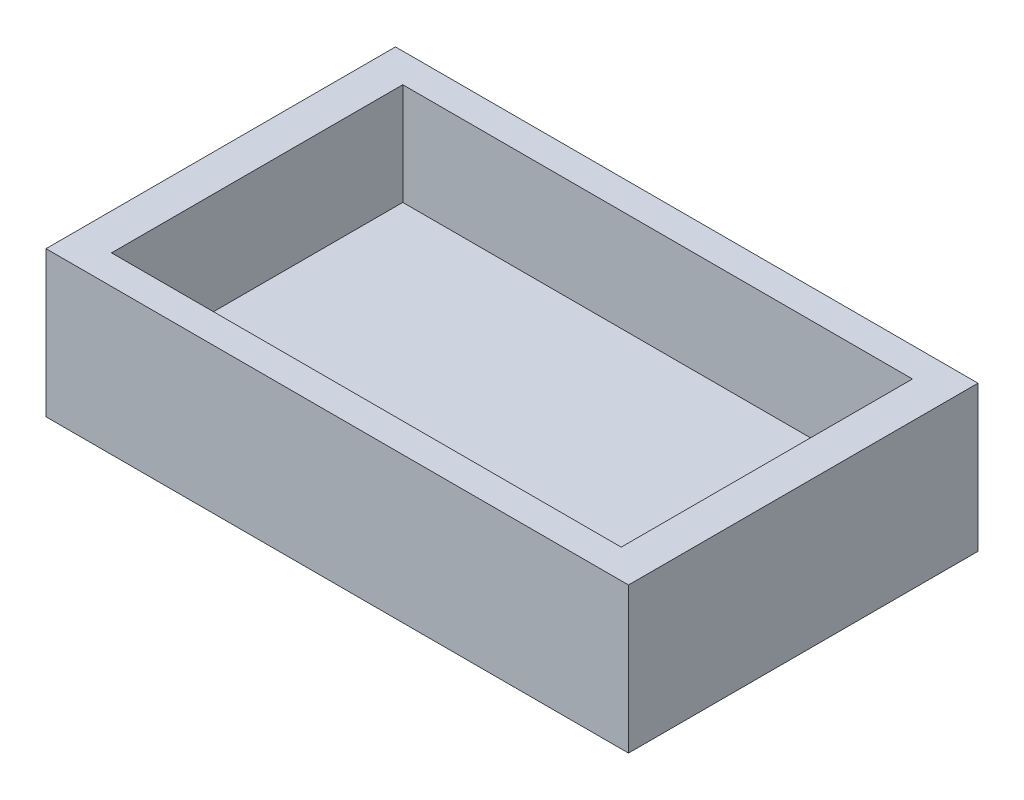
ISO-10303-21;
HEADER;
FILE_DESCRIPTION(('STEP AP214'),'2;1');
FILE_NAME('part.step','',(''),(''),'','','');
FILE_SCHEMA(('AUTOMOTIVE_DESIGN { 1 0 10303 214 1 1 1 1 }'));
ENDSEC;
DATA;
#1=APPLICATION_CONTEXT('core data for automotive mechanical design processes');
#2=APPLICATION_PROTOCOL_DEFINITION('international standard','automotive_design',2000,#1);
#3=PRODUCT_CONTEXT('',#1,'mechanical');
#4=PRODUCT('Part','Part','',(#3));
#5=PRODUCT_RELATED_PRODUCT_CATEGORY('part','',(#4));
#6=PRODUCT_DEFINITION_FORMATION('','',#4);
#7=PRODUCT_DEFINITION_CONTEXT('part definition',#1,'design');
#8=PRODUCT_DEFINITION('design','',#6,#7);
#9=PRODUCT_DEFINITION_SHAPE('','',#8);
#10=(LENGTH_UNIT() NAMED_UNIT(*) SI_UNIT(.MILLI.,.METRE.));
#11=(NAMED_UNIT(*) PLANE_ANGLE_UNIT() SI_UNIT($,.RADIAN.));
#12=(NAMED_UNIT(*) SI_UNIT($,.STERADIAN.) SOLID_ANGLE_UNIT());
#13=UNCERTAINTY_MEASURE_WITH_UNIT(LENGTH_MEASURE(1.E-05),#10,'distance_accuracy_value','');
#14=(GEOMETRIC_REPRESENTATION_CONTEXT(3) GLOBAL_UNCERTAINTY_ASSIGNED_CONTEXT((#13)) GLOBAL_UNIT_ASSIGNED_CONTEXT((#10,
#11,#12)) REPRESENTATION_CONTEXT('',''));
#15=CARTESIAN_POINT('',(0.,0.,0.));
#16=DIRECTION('',(0.,0.,1.));
#17=DIRECTION('',(1.,0.,0.));
#18=AXIS2_PLACEMENT_3D('',#15,#16,#17);
#19=CARTESIAN_POINT('',(20.,10.,-12.));
#20=DIRECTION('',(-1.,0.,0.));
#21=DIRECTION('',(0.,0.,1.));
#22=AXIS2_PLACEMENT_3D('',#19,#20,#21);
#23=PLANE('',#22);
#24=DIRECTION('',(0.,0.,1.));
#25=VECTOR('',#24,1.);
#26=CARTESIAN_POINT('',(20.,0.,-12.));
#27=LINE('',#26,#25);
#28=CARTESIAN_POINT('',(20.,0.,12.));
#29=VERTEX_POINT('',#28);
#30=CARTESIAN_POINT('',(20.,0.,-12.));
#31=VERTEX_POINT('',#30);
#32=EDGE_CURVE('E143',#29,#31,#27,.F.);
#33=ORIENTED_EDGE('',*,*,#32,.T.);
#34=DIRECTION('',(0.,-1.,0.));
#35=VECTOR('',#34,1.);
#36=CARTESIAN_POINT('',(20.,10.,-12.));
#37=LINE('',#36,#35);
#38=CARTESIAN_POINT('',(20.,10.,-12.));
#39=VERTEX_POINT('',#38);
#40=EDGE_CURVE('E12',#39,#31,#37,.T.);
#41=ORIENTED_EDGE('',*,*,#40,.F.);
#42=DIRECTION('',(0.,0.,-1.));
#43=VECTOR('',#42,1.);
#44=CARTESIAN_POINT('',(20.,10.,-12.));
#45=LINE('',#44,#43);
#46=CARTESIAN_POINT('',(20.,10.,12.));
#47=VERTEX_POINT('',#46);
#48=EDGE_CURVE('E142',#47,#39,#45,.T.);
#49=ORIENTED_EDGE('',*,*,#48,.F.);
#50=DIRECTION('',(0.,-1.,0.));
#51=VECTOR('',#50,1.);
#52=CARTESIAN_POINT('',(20.,10.,12.));
#53=LINE('',#52,#51);
#54=EDGE_CURVE('E130',#47,#29,#53,.T.);
#55=ORIENTED_EDGE('',*,*,#54,.T.);
#56=EDGE_LOOP('',(#33,#41,#49,#55));
#57=FACE_BOUND('',#56,.T.);
#58=ADVANCED_FACE('F38',(#57),#23,.F.);
#59=CARTESIAN_POINT('',(-20.,10.,-12.));
#60=DIRECTION('',(0.,0.,1.));
#61=DIRECTION('',(1.,0.,0.));
#62=AXIS2_PLACEMENT_3D('',#59,#60,#61);
#63=PLANE('',#62);
#64=DIRECTION('',(1.,0.,0.));
#65=VECTOR('',#64,1.);
#66=CARTESIAN_POINT('',(-20.,0.,-12.));
#67=LINE('',#66,#65);
#68=CARTESIAN_POINT('',(-20.,0.,-12.));
#69=VERTEX_POINT('',#68);
#70=EDGE_CURVE('E41',#31,#69,#67,.F.);
#71=ORIENTED_EDGE('',*,*,#70,.T.);
#72=DIRECTION('',(0.,-1.,0.));
#73=VECTOR('',#72,1.);
#74=CARTESIAN_POINT('',(-20.,10.,-12.));
#75=LINE('',#74,#73);
#76=CARTESIAN_POINT('',(-20.,10.,-12.));
#77=VERTEX_POINT('',#76);
#78=EDGE_CURVE('E47',#77,#69,#75,.T.);
#79=ORIENTED_EDGE('',*,*,#78,.F.);
#80=DIRECTION('',(-1.,0.,0.));
#81=VECTOR('',#80,1.);
#82=CARTESIAN_POINT('',(-20.,10.,-12.));
#83=LINE('',#82,#81);
#84=EDGE_CURVE('E118',#39,#77,#83,.T.);
#85=ORIENTED_EDGE('',*,*,#84,.F.);
#86=ORIENTED_EDGE('',*,*,#40,.T.);
#87=EDGE_LOOP('',(#71,#79,#85,#86));
#88=FACE_BOUND('',#87,.T.);
#89=ADVANCED_FACE('F164',(#88),#63,.F.);
#90=CARTESIAN_POINT('',(-20.,10.,-12.));
#91=DIRECTION('',(1.,0.,0.));
#92=DIRECTION('',(0.,0.,-1.));
#93=AXIS2_PLACEMENT_3D('',#90,#91,#92);
#94=PLANE('',#93);
#95=DIRECTION('',(0.,0.,-1.));
#96=VECTOR('',#95,1.);
#97=CARTESIAN_POINT('',(-20.,0.,-12.));
#98=LINE('',#97,#96);
#99=CARTESIAN_POINT('',(-20.,0.,12.));
#100=VERTEX_POINT('',#99);
#101=EDGE_CURVE('E127',#69,#100,#98,.F.);
#102=ORIENTED_EDGE('',*,*,#101,.T.);
#103=DIRECTION('',(0.,-1.,0.));
#104=VECTOR('',#103,1.);
#105=CARTESIAN_POINT('',(-20.,10.,12.));
#106=LINE('',#105,#104);
#107=CARTESIAN_POINT('',(-20.,10.,12.));
#108=VERTEX_POINT('',#107);
#109=EDGE_CURVE('E125',#108,#100,#106,.T.);
#110=ORIENTED_EDGE('',*,*,#109,.F.);
#111=DIRECTION('',(0.,0.,1.));
#112=VECTOR('',#111,1.);
#113=CARTESIAN_POINT('',(-20.,10.,-12.));
#114=LINE('',#113,#112);
#115=EDGE_CURVE('E111',#77,#108,#114,.T.);
#116=ORIENTED_EDGE('',*,*,#115,.F.);
#117=ORIENTED_EDGE('',*,*,#78,.T.);
#118=EDGE_LOOP('',(#102,#110,#116,#117));
#119=FACE_BOUND('',#118,.T.);
#120=ADVANCED_FACE('F126',(#119),#94,.F.);
#121=CARTESIAN_POINT('',(-20.,10.,12.));
#122=DIRECTION('',(0.,0.,-1.));
#123=DIRECTION('',(-1.,0.,0.));
#124=AXIS2_PLACEMENT_3D('',#121,#122,#123);
#125=PLANE('',#124);
#126=DIRECTION('',(-1.,0.,0.));
#127=VECTOR('',#126,1.);
#128=CARTESIAN_POINT('',(-20.,0.,12.));
#129=LINE('',#128,#127);
#130=EDGE_CURVE('E141',#100,#29,#129,.F.);
#131=ORIENTED_EDGE('',*,*,#130,.T.);
#132=ORIENTED_EDGE('',*,*,#54,.F.);
#133=DIRECTION('',(1.,0.,0.));
#134=VECTOR('',#133,1.);
#135=CARTESIAN_POINT('',(-20.,10.,12.));
#136=LINE('',#135,#134);
#137=EDGE_CURVE('E116',#108,#47,#136,.T.);
#138=ORIENTED_EDGE('',*,*,#137,.F.);
#139=ORIENTED_EDGE('',*,*,#109,.T.);
#140=EDGE_LOOP('',(#131,#132,#138,#139));
#141=FACE_BOUND('',#140,.T.);
#142=ADVANCED_FACE('F132',(#141),#125,.F.);
#143=CARTESIAN_POINT('',(0.,10.,0.));
#144=DIRECTION('',(0.,1.,0.));
#145=DIRECTION('',(0.,0.,1.));
#146=AXIS2_PLACEMENT_3D('',#143,#144,#145);
#147=PLANE('',#146);
#148=DIRECTION('',(0.,0.,-1.));
#149=VECTOR('',#148,1.);
#150=CARTESIAN_POINT('',(17.5,10.,-10.));
#151=LINE('',#150,#149);
#152=CARTESIAN_POINT('',(17.5,10.,10.));
#153=VERTEX_POINT('',#152);
#154=CARTESIAN_POINT('',(17.5,10.,-10.));
#155=VERTEX_POINT('',#154);
#156=EDGE_CURVE('E56',#153,#155,#151,.T.);
#157=ORIENTED_EDGE('',*,*,#156,.F.);
#158=DIRECTION('',(1.,0.,0.));
#159=VECTOR('',#158,1.);
#160=CARTESIAN_POINT('',(-17.5,10.,10.));
#161=LINE('',#160,#159);
#162=CARTESIAN_POINT('',(-17.5,10.,10.));
#163=VERTEX_POINT('',#162);
#164=EDGE_CURVE('E156',#163,#153,#161,.T.);
#165=ORIENTED_EDGE('',*,*,#164,.F.);
#166=DIRECTION('',(0.,0.,1.));
#167=VECTOR('',#166,1.);
#168=CARTESIAN_POINT('',(-17.5,10.,-10.));
#169=LINE('',#168,#167);
#170=CARTESIAN_POINT('',(-17.5,10.,-10.));
#171=VERTEX_POINT('',#170);
#172=EDGE_CURVE('E192',#171,#163,#169,.T.);
#173=ORIENTED_EDGE('',*,*,#172,.F.);
#174=DIRECTION('',(-1.,0.,0.));
#175=VECTOR('',#174,1.);
#176=CARTESIAN_POINT('',(-17.5,10.,-10.));
#177=LINE('',#176,#175);
#178=EDGE_CURVE('E175',#155,#171,#177,.T.);
#179=ORIENTED_EDGE('',*,*,#178,.F.);
#180=EDGE_LOOP('',(#157,#165,#173,#179));
#181=FACE_BOUND('',#180,.T.);
#182=ORIENTED_EDGE('',*,*,#48,.T.);
#183=ORIENTED_EDGE('',*,*,#84,.T.);
#184=ORIENTED_EDGE('',*,*,#115,.T.);
#185=ORIENTED_EDGE('',*,*,#137,.T.);
#186=EDGE_LOOP('',(#182,#183,#184,#185));
#187=FACE_BOUND('',#186,.T.);
#188=ADVANCED_FACE('F114',(#181,#187),#147,.T.);
#189=CARTESIAN_POINT('',(17.5,3.,-10.));
#190=DIRECTION('',(1.,0.,0.));
#191=DIRECTION('',(0.,0.,-1.));
#192=AXIS2_PLACEMENT_3D('',#189,#190,#191);
#193=PLANE('',#192);
#194=ORIENTED_EDGE('',*,*,#156,.T.);
#195=DIRECTION('',(0.,1.,0.));
#196=VECTOR('',#195,1.);
#197=CARTESIAN_POINT('',(17.5,3.,-10.));
#198=LINE('',#197,#196);
#199=CARTESIAN_POINT('',(17.5,3.,-10.));
#200=VERTEX_POINT('',#199);
#201=EDGE_CURVE('E160',#200,#155,#198,.T.);
#202=ORIENTED_EDGE('',*,*,#201,.F.);
#203=DIRECTION('',(0.,0.,-1.));
#204=VECTOR('',#203,1.);
#205=CARTESIAN_POINT('',(17.5,3.,-10.));
#206=LINE('',#205,#204);
#207=CARTESIAN_POINT('',(17.5,3.,10.));
#208=VERTEX_POINT('',#207);
#209=EDGE_CURVE('E180',#208,#200,#206,.T.);
#210=ORIENTED_EDGE('',*,*,#209,.F.);
#211=DIRECTION('',(0.,1.,0.));
#212=VECTOR('',#211,1.);
#213=CARTESIAN_POINT('',(17.5,3.,10.));
#214=LINE('',#213,#212);
#215=EDGE_CURVE('E145',#208,#153,#214,.T.);
#216=ORIENTED_EDGE('',*,*,#215,.T.);
#217=EDGE_LOOP('',(#194,#202,#210,#216));
#218=FACE_BOUND('',#217,.T.);
#219=ADVANCED_FACE('F206',(#218),#193,.F.);
#220=CARTESIAN_POINT('',(-17.5,3.,10.));
#221=DIRECTION('',(0.,0.,1.));
#222=DIRECTION('',(1.,0.,0.));
#223=AXIS2_PLACEMENT_3D('',#220,#221,#222);
#224=PLANE('',#223);
#225=ORIENTED_EDGE('',*,*,#164,.T.);
#226=ORIENTED_EDGE('',*,*,#215,.F.);
#227=DIRECTION('',(1.,0.,0.));
#228=VECTOR('',#227,1.);
#229=CARTESIAN_POINT('',(-17.5,3.,10.));
#230=LINE('',#229,#228);
#231=CARTESIAN_POINT('',(-17.5,3.,10.));
#232=VERTEX_POINT('',#231);
#233=EDGE_CURVE('E162',#232,#208,#230,.T.);
#234=ORIENTED_EDGE('',*,*,#233,.F.);
#235=DIRECTION('',(0.,1.,0.));
#236=VECTOR('',#235,1.);
#237=CARTESIAN_POINT('',(-17.5,3.,10.));
#238=LINE('',#237,#236);
#239=EDGE_CURVE('E149',#232,#163,#238,.T.);
#240=ORIENTED_EDGE('',*,*,#239,.T.);
#241=EDGE_LOOP('',(#225,#226,#234,#240));
#242=FACE_BOUND('',#241,.T.);
#243=ADVANCED_FACE('F198',(#242),#224,.F.);
#244=CARTESIAN_POINT('',(-17.5,3.,-10.));
#245=DIRECTION('',(-1.,0.,0.));
#246=DIRECTION('',(0.,0.,1.));
#247=AXIS2_PLACEMENT_3D('',#244,#245,#246);
#248=PLANE('',#247);
#249=ORIENTED_EDGE('',*,*,#172,.T.);
#250=ORIENTED_EDGE('',*,*,#239,.F.);
#251=DIRECTION('',(0.,0.,1.));
#252=VECTOR('',#251,1.);
#253=CARTESIAN_POINT('',(-17.5,3.,-10.));
#254=LINE('',#253,#252);
#255=CARTESIAN_POINT('',(-17.5,3.,-10.));
#256=VERTEX_POINT('',#255);
#257=EDGE_CURVE('E186',#256,#232,#254,.T.);
#258=ORIENTED_EDGE('',*,*,#257,.F.);
#259=DIRECTION('',(0.,1.,0.));
#260=VECTOR('',#259,1.);
#261=CARTESIAN_POINT('',(-17.5,3.,-10.));
#262=LINE('',#261,#260);
#263=EDGE_CURVE('E153',#256,#171,#262,.T.);
#264=ORIENTED_EDGE('',*,*,#263,.T.);
#265=EDGE_LOOP('',(#249,#250,#258,#264));
#266=FACE_BOUND('',#265,.T.);
#267=ADVANCED_FACE('F209',(#266),#248,.F.);
#268=CARTESIAN_POINT('',(-17.5,3.,-10.));
#269=DIRECTION('',(0.,0.,-1.));
#270=DIRECTION('',(-1.,0.,0.));
#271=AXIS2_PLACEMENT_3D('',#268,#269,#270);
#272=PLANE('',#271);
#273=ORIENTED_EDGE('',*,*,#178,.T.);
#274=ORIENTED_EDGE('',*,*,#263,.F.);
#275=DIRECTION('',(-1.,0.,0.));
#276=VECTOR('',#275,1.);
#277=CARTESIAN_POINT('',(-17.5,3.,-10.));
#278=LINE('',#277,#276);
#279=EDGE_CURVE('E183',#200,#256,#278,.T.);
#280=ORIENTED_EDGE('',*,*,#279,.F.);
#281=ORIENTED_EDGE('',*,*,#201,.T.);
#282=EDGE_LOOP('',(#273,#274,#280,#281));
#283=FACE_BOUND('',#282,.T.);
#284=ADVANCED_FACE('F203',(#283),#272,.F.);
#285=CARTESIAN_POINT('',(0.,3.,0.));
#286=DIRECTION('',(0.,1.,0.));
#287=DIRECTION('',(0.,0.,1.));
#288=AXIS2_PLACEMENT_3D('',#285,#286,#287);
#289=PLANE('',#288);
#290=ORIENTED_EDGE('',*,*,#209,.T.);
#291=ORIENTED_EDGE('',*,*,#279,.T.);
#292=ORIENTED_EDGE('',*,*,#257,.T.);
#293=ORIENTED_EDGE('',*,*,#233,.T.);
#294=EDGE_LOOP('',(#290,#291,#292,#293));
#295=FACE_BOUND('',#294,.T.);
#296=ADVANCED_FACE('F208',(#295),#289,.T.);
#297=CARTESIAN_POINT('',(0.,-5.9016393442623,-4.91803278688525));
#298=DIRECTION('',(0.,0.768221279597376,0.64018439966448));
#299=DIRECTION('',(0.,-0.64018439966448,0.768221279597376));
#300=AXIS2_PLACEMENT_3D('',#297,#298,#299);
#301=PLANE('',#300);
#302=DIRECTION('',(-0.788110406239101,-0.39405520311955,0.47286624374346));
#303=VECTOR('',#302,1.);
#304=CARTESIAN_POINT('',(20.,0.,-12.));
#305=LINE('',#304,#303);
#306=CARTESIAN_POINT('',(0.,-10.,0.));
#307=VERTEX_POINT('',#306);
#308=EDGE_CURVE('E75',#31,#307,#305,.T.);
#309=ORIENTED_EDGE('',*,*,#308,.T.);
#310=DIRECTION('',(0.788110406239101,-0.39405520311955,0.47286624374346));
#311=VECTOR('',#310,1.);
#312=CARTESIAN_POINT('',(-20.,0.,-12.));
#313=LINE('',#312,#311);
#314=EDGE_CURVE('E83',#69,#307,#313,.T.);
#315=ORIENTED_EDGE('',*,*,#314,.F.);
#316=ORIENTED_EDGE('',*,*,#70,.F.);
#317=EDGE_LOOP('',(#309,#315,#316));
#318=FACE_BOUND('',#317,.T.);
#319=ADVANCED_FACE('F166',(#318),#301,.F.);
#320=CARTESIAN_POINT('',(-4.,-8.,0.));
#321=DIRECTION('',(0.447213595499958,0.894427190999916,0.));
#322=DIRECTION('',(-0.894427190999916,0.447213595499958,0.));
#323=AXIS2_PLACEMENT_3D('',#320,#321,#322);
#324=PLANE('',#323);
#325=ORIENTED_EDGE('',*,*,#314,.T.);
#326=DIRECTION('',(0.788110406239101,-0.39405520311955,-0.47286624374346));
#327=VECTOR('',#326,1.);
#328=CARTESIAN_POINT('',(-20.,0.,12.));
#329=LINE('',#328,#327);
#330=EDGE_CURVE('E171',#100,#307,#329,.T.);
#331=ORIENTED_EDGE('',*,*,#330,.F.);
#332=ORIENTED_EDGE('',*,*,#101,.F.);
#333=EDGE_LOOP('',(#325,#331,#332));
#334=FACE_BOUND('',#333,.T.);
#335=ADVANCED_FACE('F169',(#334),#324,.F.);
#336=CARTESIAN_POINT('',(4.,-8.,0.));
#337=DIRECTION('',(-0.447213595499958,0.894427190999916,0.));
#338=DIRECTION('',(-0.894427190999916,-0.447213595499958,0.));
#339=AXIS2_PLACEMENT_3D('',#336,#337,#338);
#340=PLANE('',#339);
#341=DIRECTION('',(-0.788110406239101,-0.39405520311955,-0.47286624374346));
#342=VECTOR('',#341,1.);
#343=CARTESIAN_POINT('',(20.,0.,12.));
#344=LINE('',#343,#342);
#345=EDGE_CURVE('E167',#29,#307,#344,.T.);
#346=ORIENTED_EDGE('',*,*,#345,.T.);
#347=ORIENTED_EDGE('',*,*,#308,.F.);
#348=ORIENTED_EDGE('',*,*,#32,.F.);
#349=EDGE_LOOP('',(#346,#347,#348));
#350=FACE_BOUND('',#349,.T.);
#351=ADVANCED_FACE('F296',(#350),#340,.F.);
#352=CARTESIAN_POINT('',(0.,-5.9016393442623,4.91803278688525));
#353=DIRECTION('',(0.,0.768221279597376,-0.64018439966448));
#354=DIRECTION('',(0.,0.64018439966448,0.768221279597376));
#355=AXIS2_PLACEMENT_3D('',#352,#353,#354);
#356=PLANE('',#355);
#357=ORIENTED_EDGE('',*,*,#330,.T.);
#358=ORIENTED_EDGE('',*,*,#345,.F.);
#359=ORIENTED_EDGE('',*,*,#130,.F.);
#360=EDGE_LOOP('',(#357,#358,#359));
#361=FACE_BOUND('',#360,.T.);
#362=ADVANCED_FACE('F305',(#361),#356,.F.);
#363=CLOSED_SHELL('',(#58,#89,#120,#142,#188,#219,#243,#267,#284,#296,#319,#335,#351,#362));
#364=MANIFOLD_SOLID_BREP('B2',#363);
#365=ADVANCED_BREP_SHAPE_REPRESENTATION('',(#18,#364),#14);
#366=SHAPE_DEFINITION_REPRESENTATION(#9,#365);
ENDSEC;
END-ISO-10303-21;
